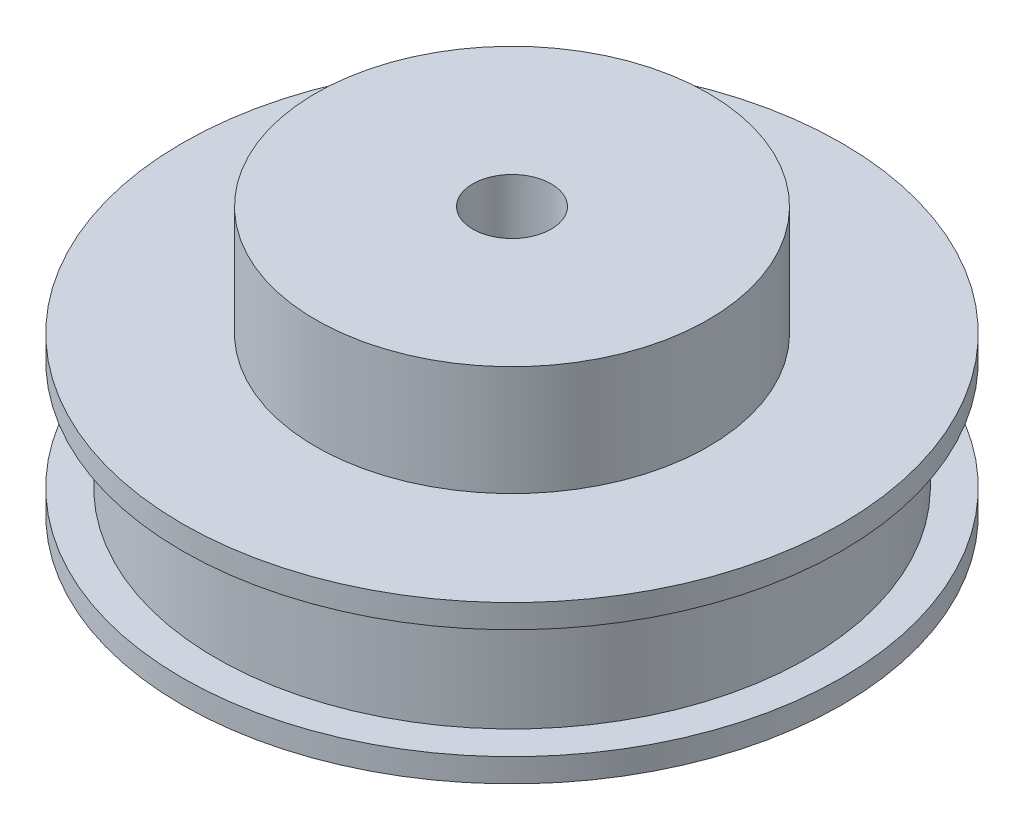
ISO-10303-21;
HEADER;
FILE_DESCRIPTION(('STEP AP214'),'2;1');
FILE_NAME('part.step','',(''),(''),'','','');
FILE_SCHEMA(('AUTOMOTIVE_DESIGN { 1 0 10303 214 1 1 1 1 }'));
ENDSEC;
DATA;
#1=APPLICATION_CONTEXT('core data for automotive mechanical design processes');
#2=APPLICATION_PROTOCOL_DEFINITION('international standard','automotive_design',2000,#1);
#3=PRODUCT_CONTEXT('',#1,'mechanical');
#4=PRODUCT('Part','Part','',(#3));
#5=PRODUCT_RELATED_PRODUCT_CATEGORY('part','',(#4));
#6=PRODUCT_DEFINITION_FORMATION('','',#4);
#7=PRODUCT_DEFINITION_CONTEXT('part definition',#1,'design');
#8=PRODUCT_DEFINITION('design','',#6,#7);
#9=PRODUCT_DEFINITION_SHAPE('','',#8);
#10=(LENGTH_UNIT() NAMED_UNIT(*) SI_UNIT(.MILLI.,.METRE.));
#11=(NAMED_UNIT(*) PLANE_ANGLE_UNIT() SI_UNIT($,.RADIAN.));
#12=(NAMED_UNIT(*) SI_UNIT($,.STERADIAN.) SOLID_ANGLE_UNIT());
#13=UNCERTAINTY_MEASURE_WITH_UNIT(LENGTH_MEASURE(1.E-05),#10,'distance_accuracy_value','');
#14=(GEOMETRIC_REPRESENTATION_CONTEXT(3) GLOBAL_UNCERTAINTY_ASSIGNED_CONTEXT((#13)) GLOBAL_UNIT_ASSIGNED_CONTEXT((#10,
#11,#12)) REPRESENTATION_CONTEXT('',''));
#15=CARTESIAN_POINT('',(0.,0.,0.));
#16=DIRECTION('',(0.,0.,1.));
#17=DIRECTION('',(1.,0.,0.));
#18=AXIS2_PLACEMENT_3D('',#15,#16,#17);
#19=CARTESIAN_POINT('',(21.,0.,0.));
#20=DIRECTION('',(0.,-1.,0.));
#21=DIRECTION('',(0.,0.,-1.));
#22=AXIS2_PLACEMENT_3D('',#19,#20,#21);
#23=PLANE('',#22);
#24=CARTESIAN_POINT('',(0.,0.,0.));
#25=DIRECTION('',(0.,-1.,0.));
#26=DIRECTION('',(0.,0.,-1.));
#27=AXIS2_PLACEMENT_3D('',#24,#25,#26);
#28=CIRCLE('',#27,21.);
#29=CARTESIAN_POINT('',(0.,0.,-21.));
#30=VERTEX_POINT('',#29);
#31=EDGE_CURVE('E72',#30,#30,#28,.T.);
#32=ORIENTED_EDGE('',*,*,#31,.T.);
#33=EDGE_LOOP('',(#32));
#34=FACE_BOUND('',#33,.T.);
#35=CARTESIAN_POINT('',(0.,0.,0.));
#36=DIRECTION('',(0.,-1.,0.));
#37=DIRECTION('',(0.,0.,-1.));
#38=AXIS2_PLACEMENT_3D('',#35,#36,#37);
#39=CIRCLE('',#38,2.5);
#40=CARTESIAN_POINT('',(0.,0.,-2.5));
#41=VERTEX_POINT('',#40);
#42=EDGE_CURVE('E10',#41,#41,#39,.T.);
#43=ORIENTED_EDGE('',*,*,#42,.F.);
#44=EDGE_LOOP('',(#43));
#45=FACE_BOUND('',#44,.T.);
#46=ADVANCED_FACE('F38',(#34,#45),#23,.T.);
#47=CARTESIAN_POINT('',(0.,0.,0.));
#48=DIRECTION('',(0.,-1.,0.));
#49=DIRECTION('',(0.,0.,-1.));
#50=AXIS2_PLACEMENT_3D('',#47,#48,#49);
#51=CYLINDRICAL_SURFACE('',#50,2.5);
#52=ORIENTED_EDGE('',*,*,#42,.T.);
#53=EDGE_LOOP('',(#52));
#54=FACE_BOUND('',#53,.T.);
#55=CARTESIAN_POINT('',(0.,17.,0.));
#56=DIRECTION('',(0.,-1.,0.));
#57=DIRECTION('',(0.,0.,-1.));
#58=AXIS2_PLACEMENT_3D('',#55,#56,#57);
#59=CIRCLE('',#58,2.5);
#60=CARTESIAN_POINT('',(0.,17.,-2.5));
#61=VERTEX_POINT('',#60);
#62=EDGE_CURVE('E44',#61,#61,#59,.T.);
#63=ORIENTED_EDGE('',*,*,#62,.F.);
#64=EDGE_LOOP('',(#63));
#65=FACE_BOUND('',#64,.T.);
#66=ADVANCED_FACE('F90',(#54,#65),#51,.F.);
#67=CARTESIAN_POINT('',(2.5,17.,0.));
#68=DIRECTION('',(0.,1.,0.));
#69=DIRECTION('',(0.,0.,1.));
#70=AXIS2_PLACEMENT_3D('',#67,#68,#69);
#71=PLANE('',#70);
#72=ORIENTED_EDGE('',*,*,#62,.T.);
#73=EDGE_LOOP('',(#72));
#74=FACE_BOUND('',#73,.T.);
#75=CARTESIAN_POINT('',(0.,17.,0.));
#76=DIRECTION('',(0.,-1.,0.));
#77=DIRECTION('',(0.,0.,-1.));
#78=AXIS2_PLACEMENT_3D('',#75,#76,#77);
#79=CIRCLE('',#78,12.5);
#80=CARTESIAN_POINT('',(0.,17.,-12.5));
#81=VERTEX_POINT('',#80);
#82=EDGE_CURVE('E48',#81,#81,#79,.T.);
#83=ORIENTED_EDGE('',*,*,#82,.F.);
#84=EDGE_LOOP('',(#83));
#85=FACE_BOUND('',#84,.T.);
#86=ADVANCED_FACE('F94',(#74,#85),#71,.T.);
#87=CARTESIAN_POINT('',(0.,0.,0.));
#88=DIRECTION('',(0.,-1.,0.));
#89=DIRECTION('',(0.,0.,-1.));
#90=AXIS2_PLACEMENT_3D('',#87,#88,#89);
#91=CYLINDRICAL_SURFACE('',#90,12.5);
#92=ORIENTED_EDGE('',*,*,#82,.T.);
#93=EDGE_LOOP('',(#92));
#94=FACE_BOUND('',#93,.T.);
#95=CARTESIAN_POINT('',(0.,10.,0.));
#96=DIRECTION('',(0.,-1.,0.));
#97=DIRECTION('',(0.,0.,-1.));
#98=AXIS2_PLACEMENT_3D('',#95,#96,#97);
#99=CIRCLE('',#98,12.5);
#100=CARTESIAN_POINT('',(0.,10.,-12.5));
#101=VERTEX_POINT('',#100);
#102=EDGE_CURVE('E52',#101,#101,#99,.T.);
#103=ORIENTED_EDGE('',*,*,#102,.F.);
#104=EDGE_LOOP('',(#103));
#105=FACE_BOUND('',#104,.T.);
#106=ADVANCED_FACE('F98',(#94,#105),#91,.T.);
#107=CARTESIAN_POINT('',(12.5,10.,0.));
#108=DIRECTION('',(0.,1.,0.));
#109=DIRECTION('',(0.,0.,1.));
#110=AXIS2_PLACEMENT_3D('',#107,#108,#109);
#111=PLANE('',#110);
#112=ORIENTED_EDGE('',*,*,#102,.T.);
#113=EDGE_LOOP('',(#112));
#114=FACE_BOUND('',#113,.T.);
#115=CARTESIAN_POINT('',(0.,10.,0.));
#116=DIRECTION('',(0.,-1.,0.));
#117=DIRECTION('',(0.,0.,-1.));
#118=AXIS2_PLACEMENT_3D('',#115,#116,#117);
#119=CIRCLE('',#118,21.);
#120=CARTESIAN_POINT('',(0.,10.,-21.));
#121=VERTEX_POINT('',#120);
#122=EDGE_CURVE('E57',#121,#121,#119,.T.);
#123=ORIENTED_EDGE('',*,*,#122,.F.);
#124=EDGE_LOOP('',(#123));
#125=FACE_BOUND('',#124,.T.);
#126=ADVANCED_FACE('F104',(#114,#125),#111,.T.);
#127=CARTESIAN_POINT('',(0.,0.,0.));
#128=DIRECTION('',(0.,-1.,0.));
#129=DIRECTION('',(0.,0.,-1.));
#130=AXIS2_PLACEMENT_3D('',#127,#128,#129);
#131=CYLINDRICAL_SURFACE('',#130,21.);
#132=ORIENTED_EDGE('',*,*,#122,.T.);
#133=EDGE_LOOP('',(#132));
#134=FACE_BOUND('',#133,.T.);
#135=CARTESIAN_POINT('',(0.,8.50000000000001,0.));
#136=DIRECTION('',(0.,-1.,0.));
#137=DIRECTION('',(0.,0.,-1.));
#138=AXIS2_PLACEMENT_3D('',#135,#136,#137);
#139=CIRCLE('',#138,21.);
#140=CARTESIAN_POINT('',(0.,8.50000000000001,-21.));
#141=VERTEX_POINT('',#140);
#142=EDGE_CURVE('E60',#141,#141,#139,.T.);
#143=ORIENTED_EDGE('',*,*,#142,.F.);
#144=EDGE_LOOP('',(#143));
#145=FACE_BOUND('',#144,.T.);
#146=ADVANCED_FACE('F108',(#134,#145),#131,.T.);
#147=CARTESIAN_POINT('',(21.,8.5,0.));
#148=DIRECTION('',(0.,-1.,0.));
#149=DIRECTION('',(0.,0.,-1.));
#150=AXIS2_PLACEMENT_3D('',#147,#148,#149);
#151=PLANE('',#150);
#152=ORIENTED_EDGE('',*,*,#142,.T.);
#153=EDGE_LOOP('',(#152));
#154=FACE_BOUND('',#153,.T.);
#155=CARTESIAN_POINT('',(0.,8.5,0.));
#156=DIRECTION('',(0.,-1.,0.));
#157=DIRECTION('',(0.,0.,-1.));
#158=AXIS2_PLACEMENT_3D('',#155,#156,#157);
#159=CIRCLE('',#158,18.84);
#160=CARTESIAN_POINT('',(0.,8.5,-18.84));
#161=VERTEX_POINT('',#160);
#162=EDGE_CURVE('E63',#161,#161,#159,.T.);
#163=ORIENTED_EDGE('',*,*,#162,.F.);
#164=EDGE_LOOP('',(#163));
#165=FACE_BOUND('',#164,.T.);
#166=ADVANCED_FACE('F112',(#154,#165),#151,.T.);
#167=CARTESIAN_POINT('',(0.,0.,0.));
#168=DIRECTION('',(0.,-1.,0.));
#169=DIRECTION('',(0.,0.,-1.));
#170=AXIS2_PLACEMENT_3D('',#167,#168,#169);
#171=CYLINDRICAL_SURFACE('',#170,18.84);
#172=ORIENTED_EDGE('',*,*,#162,.T.);
#173=EDGE_LOOP('',(#172));
#174=FACE_BOUND('',#173,.T.);
#175=CARTESIAN_POINT('',(0.,1.5,0.));
#176=DIRECTION('',(0.,-1.,0.));
#177=DIRECTION('',(0.,0.,-1.));
#178=AXIS2_PLACEMENT_3D('',#175,#176,#177);
#179=CIRCLE('',#178,18.84);
#180=CARTESIAN_POINT('',(0.,1.5,-18.84));
#181=VERTEX_POINT('',#180);
#182=EDGE_CURVE('E66',#181,#181,#179,.T.);
#183=ORIENTED_EDGE('',*,*,#182,.F.);
#184=EDGE_LOOP('',(#183));
#185=FACE_BOUND('',#184,.T.);
#186=ADVANCED_FACE('F86',(#174,#185),#171,.T.);
#187=CARTESIAN_POINT('',(18.84,1.5,0.));
#188=DIRECTION('',(0.,1.,0.));
#189=DIRECTION('',(0.,0.,1.));
#190=AXIS2_PLACEMENT_3D('',#187,#188,#189);
#191=PLANE('',#190);
#192=ORIENTED_EDGE('',*,*,#182,.T.);
#193=EDGE_LOOP('',(#192));
#194=FACE_BOUND('',#193,.T.);
#195=CARTESIAN_POINT('',(0.,1.5,0.));
#196=DIRECTION('',(0.,-1.,0.));
#197=DIRECTION('',(0.,0.,-1.));
#198=AXIS2_PLACEMENT_3D('',#195,#196,#197);
#199=CIRCLE('',#198,21.);
#200=CARTESIAN_POINT('',(0.,1.5,-21.));
#201=VERTEX_POINT('',#200);
#202=EDGE_CURVE('E69',#201,#201,#199,.T.);
#203=ORIENTED_EDGE('',*,*,#202,.F.);
#204=EDGE_LOOP('',(#203));
#205=FACE_BOUND('',#204,.T.);
#206=ADVANCED_FACE('F80',(#194,#205),#191,.T.);
#207=CARTESIAN_POINT('',(0.,0.,0.));
#208=DIRECTION('',(0.,-1.,0.));
#209=DIRECTION('',(0.,0.,-1.));
#210=AXIS2_PLACEMENT_3D('',#207,#208,#209);
#211=CYLINDRICAL_SURFACE('',#210,21.);
#212=ORIENTED_EDGE('',*,*,#202,.T.);
#213=EDGE_LOOP('',(#212));
#214=FACE_BOUND('',#213,.T.);
#215=ORIENTED_EDGE('',*,*,#31,.F.);
#216=EDGE_LOOP('',(#215));
#217=FACE_BOUND('',#216,.T.);
#218=ADVANCED_FACE('F78',(#214,#217),#211,.T.);
#219=CLOSED_SHELL('',(#46,#66,#86,#106,#126,#146,#166,#186,#206,#218));
#220=MANIFOLD_SOLID_BREP('B2',#219);
#221=ADVANCED_BREP_SHAPE_REPRESENTATION('',(#18,#220),#14);
#222=SHAPE_DEFINITION_REPRESENTATION(#9,#221);
ENDSEC;
END-ISO-10303-21;
